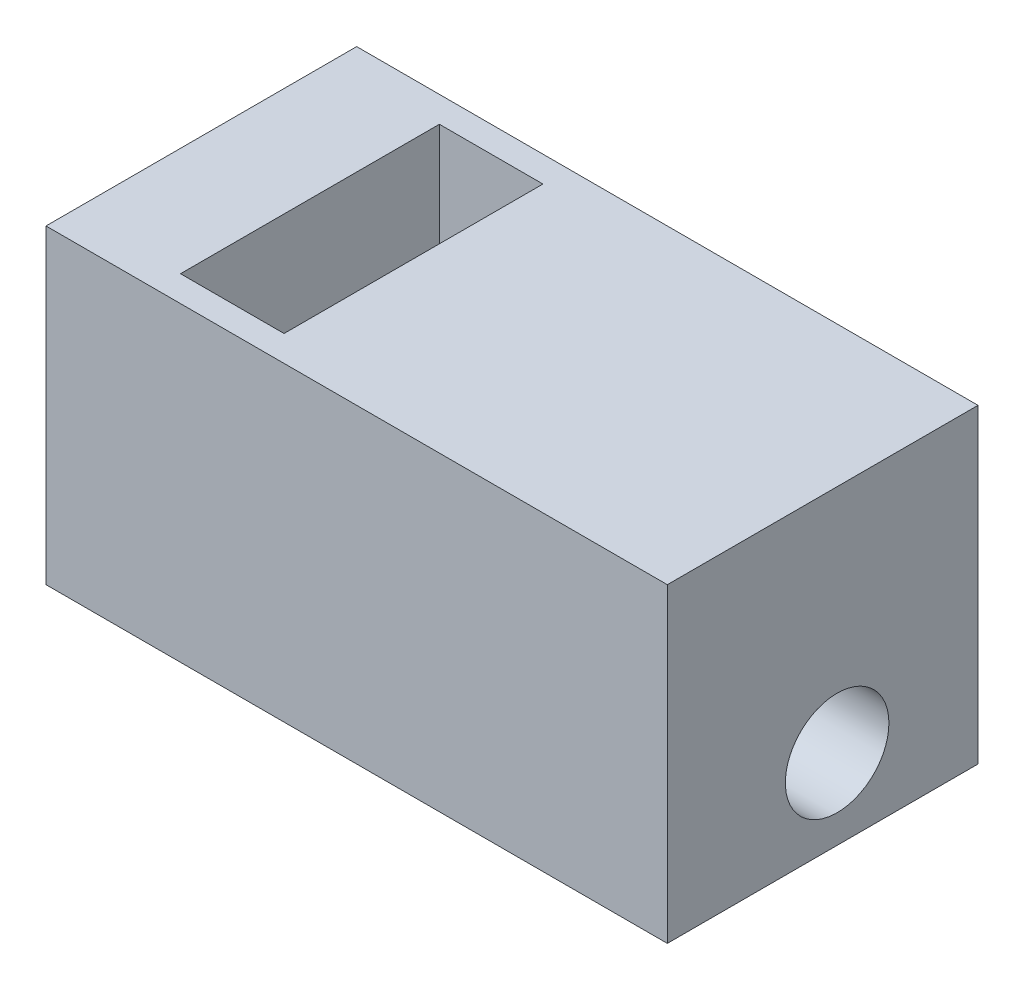
ISO-10303-21;
HEADER;
FILE_DESCRIPTION(('STEP AP214'),'2;1');
FILE_NAME('part.step','',(''),(''),'','','');
FILE_SCHEMA(('AUTOMOTIVE_DESIGN { 1 0 10303 214 1 1 1 1 }'));
ENDSEC;
DATA;
#1=APPLICATION_CONTEXT('core data for automotive mechanical design processes');
#2=APPLICATION_PROTOCOL_DEFINITION('international standard','automotive_design',2000,#1);
#3=PRODUCT_CONTEXT('',#1,'mechanical');
#4=PRODUCT('Part','Part','',(#3));
#5=PRODUCT_RELATED_PRODUCT_CATEGORY('part','',(#4));
#6=PRODUCT_DEFINITION_FORMATION('','',#4);
#7=PRODUCT_DEFINITION_CONTEXT('part definition',#1,'design');
#8=PRODUCT_DEFINITION('design','',#6,#7);
#9=PRODUCT_DEFINITION_SHAPE('','',#8);
#10=(LENGTH_UNIT() NAMED_UNIT(*) SI_UNIT(.MILLI.,.METRE.));
#11=(NAMED_UNIT(*) PLANE_ANGLE_UNIT() SI_UNIT($,.RADIAN.));
#12=(NAMED_UNIT(*) SI_UNIT($,.STERADIAN.) SOLID_ANGLE_UNIT());
#13=UNCERTAINTY_MEASURE_WITH_UNIT(LENGTH_MEASURE(1.E-05),#10,'distance_accuracy_value','');
#14=(GEOMETRIC_REPRESENTATION_CONTEXT(3) GLOBAL_UNCERTAINTY_ASSIGNED_CONTEXT((#13)) GLOBAL_UNIT_ASSIGNED_CONTEXT((#10,
#11,#12)) REPRESENTATION_CONTEXT('',''));
#15=CARTESIAN_POINT('',(0.,0.,0.));
#16=DIRECTION('',(0.,0.,1.));
#17=DIRECTION('',(1.,0.,0.));
#18=AXIS2_PLACEMENT_3D('',#15,#16,#17);
#19=CARTESIAN_POINT('',(-62.7474074074074,76.2,-36.0303703703704));
#20=DIRECTION('',(1.,0.,0.));
#21=DIRECTION('',(0.,0.,-1.));
#22=AXIS2_PLACEMENT_3D('',#19,#20,#21);
#23=PLANE('',#22);
#24=CARTESIAN_POINT('',(-62.7474074074074,19.6328159242611,-1.47817353605362));
#25=DIRECTION('',(1.,0.,0.));
#26=DIRECTION('',(0.,0.,-1.));
#27=AXIS2_PLACEMENT_3D('',#24,#25,#26);
#28=CIRCLE('',#27,12.7);
#29=CARTESIAN_POINT('',(-62.7474074074074,19.6328159242611,-14.1781735360536));
#30=VERTEX_POINT('',#29);
#31=EDGE_CURVE('E164',#30,#30,#28,.T.);
#32=ORIENTED_EDGE('',*,*,#31,.T.);
#33=EDGE_LOOP('',(#32));
#34=FACE_BOUND('',#33,.T.);
#35=DIRECTION('',(0.,0.,1.));
#36=VECTOR('',#35,1.);
#37=CARTESIAN_POINT('',(-62.7474074074074,0.,-36.0303703703704));
#38=LINE('',#37,#36);
#39=CARTESIAN_POINT('',(-62.7474074074074,0.,-36.0303703703704));
#40=VERTEX_POINT('',#39);
#41=CARTESIAN_POINT('',(-62.7474074074074,0.,40.1696296296296));
#42=VERTEX_POINT('',#41);
#43=EDGE_CURVE('E168',#40,#42,#38,.T.);
#44=ORIENTED_EDGE('',*,*,#43,.T.);
#45=DIRECTION('',(0.,-1.,0.));
#46=VECTOR('',#45,1.);
#47=CARTESIAN_POINT('',(-62.7474074074074,76.2,40.1696296296296));
#48=LINE('',#47,#46);
#49=CARTESIAN_POINT('',(-62.7474074074074,76.2,40.1696296296296));
#50=VERTEX_POINT('',#49);
#51=EDGE_CURVE('E11',#50,#42,#48,.T.);
#52=ORIENTED_EDGE('',*,*,#51,.F.);
#53=DIRECTION('',(0.,0.,1.));
#54=VECTOR('',#53,1.);
#55=CARTESIAN_POINT('',(-62.7474074074074,76.2,-36.0303703703704));
#56=LINE('',#55,#54);
#57=CARTESIAN_POINT('',(-62.7474074074074,76.2,-36.0303703703704));
#58=VERTEX_POINT('',#57);
#59=EDGE_CURVE('E172',#58,#50,#56,.T.);
#60=ORIENTED_EDGE('',*,*,#59,.F.);
#61=DIRECTION('',(0.,-1.,0.));
#62=VECTOR('',#61,1.);
#63=CARTESIAN_POINT('',(-62.7474074074074,76.2,-36.0303703703704));
#64=LINE('',#63,#62);
#65=EDGE_CURVE('E182',#58,#40,#64,.T.);
#66=ORIENTED_EDGE('',*,*,#65,.T.);
#67=EDGE_LOOP('',(#44,#52,#60,#66));
#68=FACE_BOUND('',#67,.T.);
#69=ADVANCED_FACE('F39',(#34,#68),#23,.F.);
#70=CARTESIAN_POINT('',(-62.7474074074074,76.2,40.1696296296296));
#71=DIRECTION('',(0.,0.,-1.));
#72=DIRECTION('',(-1.,0.,0.));
#73=AXIS2_PLACEMENT_3D('',#70,#71,#72);
#74=PLANE('',#73);
#75=DIRECTION('',(1.,0.,0.));
#76=VECTOR('',#75,1.);
#77=CARTESIAN_POINT('',(-62.7474074074074,0.,40.1696296296296));
#78=LINE('',#77,#76);
#79=CARTESIAN_POINT('',(89.6525925925926,0.,40.1696296296296));
#80=VERTEX_POINT('',#79);
#81=EDGE_CURVE('E186',#42,#80,#78,.T.);
#82=ORIENTED_EDGE('',*,*,#81,.T.);
#83=DIRECTION('',(0.,-1.,0.));
#84=VECTOR('',#83,1.);
#85=CARTESIAN_POINT('',(89.6525925925926,76.2,40.1696296296296));
#86=LINE('',#85,#84);
#87=CARTESIAN_POINT('',(89.6525925925926,76.2,40.1696296296296));
#88=VERTEX_POINT('',#87);
#89=EDGE_CURVE('E47',#88,#80,#86,.T.);
#90=ORIENTED_EDGE('',*,*,#89,.F.);
#91=DIRECTION('',(1.,0.,0.));
#92=VECTOR('',#91,1.);
#93=CARTESIAN_POINT('',(-62.7474074074074,76.2,40.1696296296296));
#94=LINE('',#93,#92);
#95=EDGE_CURVE('E91',#50,#88,#94,.T.);
#96=ORIENTED_EDGE('',*,*,#95,.F.);
#97=ORIENTED_EDGE('',*,*,#51,.T.);
#98=EDGE_LOOP('',(#82,#90,#96,#97));
#99=FACE_BOUND('',#98,.T.);
#100=ADVANCED_FACE('F221',(#99),#74,.F.);
#101=CARTESIAN_POINT('',(89.6525925925926,76.2,-36.0303703703704));
#102=DIRECTION('',(-1.,0.,0.));
#103=DIRECTION('',(0.,0.,1.));
#104=AXIS2_PLACEMENT_3D('',#101,#102,#103);
#105=PLANE('',#104);
#106=CARTESIAN_POINT('',(89.6525925925926,19.6328159242611,-1.47817353605362));
#107=DIRECTION('',(1.,0.,0.));
#108=DIRECTION('',(0.,0.,-1.));
#109=AXIS2_PLACEMENT_3D('',#106,#107,#108);
#110=CIRCLE('',#109,12.7);
#111=CARTESIAN_POINT('',(89.6525925925926,19.6328159242611,-14.1781735360536));
#112=VERTEX_POINT('',#111);
#113=EDGE_CURVE('E158',#112,#112,#110,.T.);
#114=ORIENTED_EDGE('',*,*,#113,.F.);
#115=EDGE_LOOP('',(#114));
#116=FACE_BOUND('',#115,.T.);
#117=DIRECTION('',(0.,0.,-1.));
#118=VECTOR('',#117,1.);
#119=CARTESIAN_POINT('',(89.6525925925926,0.,-36.0303703703704));
#120=LINE('',#119,#118);
#121=CARTESIAN_POINT('',(89.6525925925926,0.,-36.0303703703704));
#122=VERTEX_POINT('',#121);
#123=EDGE_CURVE('E189',#80,#122,#120,.T.);
#124=ORIENTED_EDGE('',*,*,#123,.T.);
#125=DIRECTION('',(0.,-1.,0.));
#126=VECTOR('',#125,1.);
#127=CARTESIAN_POINT('',(89.6525925925926,76.2,-36.0303703703704));
#128=LINE('',#127,#126);
#129=CARTESIAN_POINT('',(89.6525925925926,76.2,-36.0303703703704));
#130=VERTEX_POINT('',#129);
#131=EDGE_CURVE('E196',#130,#122,#128,.T.);
#132=ORIENTED_EDGE('',*,*,#131,.F.);
#133=DIRECTION('',(0.,0.,-1.));
#134=VECTOR('',#133,1.);
#135=CARTESIAN_POINT('',(89.6525925925926,76.2,-36.0303703703704));
#136=LINE('',#135,#134);
#137=EDGE_CURVE('E177',#88,#130,#136,.T.);
#138=ORIENTED_EDGE('',*,*,#137,.F.);
#139=ORIENTED_EDGE('',*,*,#89,.T.);
#140=EDGE_LOOP('',(#124,#132,#138,#139));
#141=FACE_BOUND('',#140,.T.);
#142=ADVANCED_FACE('F203',(#116,#141),#105,.F.);
#143=CARTESIAN_POINT('',(-62.7474074074074,76.2,-36.0303703703704));
#144=DIRECTION('',(0.,0.,1.));
#145=DIRECTION('',(1.,0.,0.));
#146=AXIS2_PLACEMENT_3D('',#143,#144,#145);
#147=PLANE('',#146);
#148=DIRECTION('',(-1.,0.,0.));
#149=VECTOR('',#148,1.);
#150=CARTESIAN_POINT('',(-62.7474074074074,0.,-36.0303703703704));
#151=LINE('',#150,#149);
#152=EDGE_CURVE('E84',#122,#40,#151,.T.);
#153=ORIENTED_EDGE('',*,*,#152,.T.);
#154=ORIENTED_EDGE('',*,*,#65,.F.);
#155=DIRECTION('',(-1.,0.,0.));
#156=VECTOR('',#155,1.);
#157=CARTESIAN_POINT('',(-62.7474074074074,76.2,-36.0303703703704));
#158=LINE('',#157,#156);
#159=EDGE_CURVE('E63',#130,#58,#158,.T.);
#160=ORIENTED_EDGE('',*,*,#159,.F.);
#161=ORIENTED_EDGE('',*,*,#131,.T.);
#162=EDGE_LOOP('',(#153,#154,#160,#161));
#163=FACE_BOUND('',#162,.T.);
#164=ADVANCED_FACE('F211',(#163),#147,.F.);
#165=CARTESIAN_POINT('',(0.,76.2,0.));
#166=DIRECTION('',(0.,1.,0.));
#167=DIRECTION('',(0.,0.,1.));
#168=AXIS2_PLACEMENT_3D('',#165,#166,#167);
#169=PLANE('',#168);
#170=DIRECTION('',(0.,0.,1.));
#171=VECTOR('',#170,1.);
#172=CARTESIAN_POINT('',(-36.1071284253569,76.2,-29.6803703703704));
#173=LINE('',#172,#171);
#174=CARTESIAN_POINT('',(-36.1071284253569,76.2,-29.6803703703704));
#175=VERTEX_POINT('',#174);
#176=CARTESIAN_POINT('',(-36.1071284253569,76.2,33.8196296296296));
#177=VERTEX_POINT('',#176);
#178=EDGE_CURVE('E54',#175,#177,#173,.T.);
#179=ORIENTED_EDGE('',*,*,#178,.F.);
#180=DIRECTION('',(-1.,0.,0.));
#181=VECTOR('',#180,1.);
#182=CARTESIAN_POINT('',(-36.1071284253569,76.2,-29.6803703703704));
#183=LINE('',#182,#181);
#184=CARTESIAN_POINT('',(-10.7071284253569,76.2,-29.6803703703704));
#185=VERTEX_POINT('',#184);
#186=EDGE_CURVE('E136',#185,#175,#183,.T.);
#187=ORIENTED_EDGE('',*,*,#186,.F.);
#188=DIRECTION('',(0.,0.,-1.));
#189=VECTOR('',#188,1.);
#190=CARTESIAN_POINT('',(-10.7071284253569,76.2,-29.6803703703704));
#191=LINE('',#190,#189);
#192=CARTESIAN_POINT('',(-10.7071284253569,76.2,33.8196296296296));
#193=VERTEX_POINT('',#192);
#194=EDGE_CURVE('E140',#193,#185,#191,.T.);
#195=ORIENTED_EDGE('',*,*,#194,.F.);
#196=DIRECTION('',(1.,0.,0.));
#197=VECTOR('',#196,1.);
#198=CARTESIAN_POINT('',(-36.1071284253569,76.2,33.8196296296296));
#199=LINE('',#198,#197);
#200=EDGE_CURVE('E149',#177,#193,#199,.T.);
#201=ORIENTED_EDGE('',*,*,#200,.F.);
#202=EDGE_LOOP('',(#179,#187,#195,#201));
#203=FACE_BOUND('',#202,.T.);
#204=ORIENTED_EDGE('',*,*,#59,.T.);
#205=ORIENTED_EDGE('',*,*,#95,.T.);
#206=ORIENTED_EDGE('',*,*,#137,.T.);
#207=ORIENTED_EDGE('',*,*,#159,.T.);
#208=EDGE_LOOP('',(#204,#205,#206,#207));
#209=FACE_BOUND('',#208,.T.);
#210=ADVANCED_FACE('F213',(#203,#209),#169,.T.);
#211=CARTESIAN_POINT('',(0.,0.,0.));
#212=DIRECTION('',(0.,1.,0.));
#213=DIRECTION('',(0.,0.,1.));
#214=AXIS2_PLACEMENT_3D('',#211,#212,#213);
#215=PLANE('',#214);
#216=ORIENTED_EDGE('',*,*,#43,.F.);
#217=ORIENTED_EDGE('',*,*,#152,.F.);
#218=ORIENTED_EDGE('',*,*,#123,.F.);
#219=ORIENTED_EDGE('',*,*,#81,.F.);
#220=EDGE_LOOP('',(#216,#217,#218,#219));
#221=FACE_BOUND('',#220,.T.);
#222=ADVANCED_FACE('F207',(#221),#215,.F.);
#223=CARTESIAN_POINT('',(-62.7474074074074,19.6328159242611,-1.47817353605362));
#224=DIRECTION('',(1.,0.,0.));
#225=DIRECTION('',(0.,0.,-1.));
#226=AXIS2_PLACEMENT_3D('',#223,#224,#225);
#227=CYLINDRICAL_SURFACE('',#226,12.7);
#228=CARTESIAN_POINT('',(-62.7474074074074,19.6328159242611,-14.1781735360536));
#229=CARTESIAN_POINT('',(-61.1599074074074,19.6328159242611,-14.1781735360536));
#230=CARTESIAN_POINT('',(-59.5724074074074,19.6328159242611,-14.1781735360536));
#231=CARTESIAN_POINT('',(-56.3974074074074,19.6328159242611,-14.1781735360536));
#232=CARTESIAN_POINT('',(-54.8099074074074,19.6328159242611,-14.1781735360536));
#233=CARTESIAN_POINT('',(-51.6349074074074,19.6328159242611,-14.1781735360536));
#234=CARTESIAN_POINT('',(-50.0474074074074,19.6328159242611,-14.1781735360536));
#235=CARTESIAN_POINT('',(-46.8724074074074,19.6328159242611,-14.1781735360536));
#236=CARTESIAN_POINT('',(-45.2849074074074,19.6328159242611,-14.1781735360536));
#237=CARTESIAN_POINT('',(-42.1099074074074,19.6328159242611,-14.1781735360536));
#238=CARTESIAN_POINT('',(-40.5224074074074,19.6328159242611,-14.1781735360536));
#239=CARTESIAN_POINT('',(-37.3474074074074,19.6328159242611,-14.1781735360536));
#240=CARTESIAN_POINT('',(-35.7599074074074,19.6328159242611,-14.1781735360536));
#241=CARTESIAN_POINT('',(-32.5849074074074,19.6328159242611,-14.1781735360536));
#242=CARTESIAN_POINT('',(-30.9974074074074,19.6328159242611,-14.1781735360536));
#243=CARTESIAN_POINT('',(-27.8224074074074,19.6328159242611,-14.1781735360536));
#244=CARTESIAN_POINT('',(-26.2349074074074,19.6328159242611,-14.1781735360536));
#245=CARTESIAN_POINT('',(-23.0599074074074,19.6328159242611,-14.1781735360536));
#246=CARTESIAN_POINT('',(-21.4724074074074,19.6328159242611,-14.1781735360536));
#247=CARTESIAN_POINT('',(-18.2974074074074,19.6328159242611,-14.1781735360536));
#248=CARTESIAN_POINT('',(-16.7099074074074,19.6328159242611,-14.1781735360536));
#249=CARTESIAN_POINT('',(-13.5349074074074,19.6328159242611,-14.1781735360536));
#250=CARTESIAN_POINT('',(-11.9474074074074,19.6328159242611,-14.1781735360536));
#251=CARTESIAN_POINT('',(-8.77240740740739,19.6328159242611,-14.1781735360536));
#252=CARTESIAN_POINT('',(-7.18490740740739,19.6328159242611,-14.1781735360536));
#253=CARTESIAN_POINT('',(-4.00990740740739,19.6328159242611,-14.1781735360536));
#254=CARTESIAN_POINT('',(-2.42240740740739,19.6328159242611,-14.1781735360536));
#255=CARTESIAN_POINT('',(0.752592592592606,19.6328159242611,-14.1781735360536));
#256=CARTESIAN_POINT('',(2.3400925925926,19.6328159242611,-14.1781735360536));
#257=CARTESIAN_POINT('',(5.51509259259259,19.6328159242611,-14.1781735360536));
#258=CARTESIAN_POINT('',(7.1025925925926,19.6328159242611,-14.1781735360536));
#259=CARTESIAN_POINT('',(10.2775925925926,19.6328159242611,-14.1781735360536));
#260=CARTESIAN_POINT('',(11.8650925925926,19.6328159242611,-14.1781735360536));
#261=CARTESIAN_POINT('',(15.0400925925926,19.6328159242611,-14.1781735360536));
#262=CARTESIAN_POINT('',(16.6275925925926,19.6328159242611,-14.1781735360536));
#263=CARTESIAN_POINT('',(19.8025925925926,19.6328159242611,-14.1781735360536));
#264=CARTESIAN_POINT('',(21.3900925925926,19.6328159242611,-14.1781735360536));
#265=CARTESIAN_POINT('',(24.5650925925926,19.6328159242611,-14.1781735360536));
#266=CARTESIAN_POINT('',(26.1525925925926,19.6328159242611,-14.1781735360536));
#267=CARTESIAN_POINT('',(29.3275925925926,19.6328159242611,-14.1781735360536));
#268=CARTESIAN_POINT('',(30.9150925925926,19.6328159242611,-14.1781735360536));
#269=CARTESIAN_POINT('',(34.0900925925926,19.6328159242611,-14.1781735360536));
#270=CARTESIAN_POINT('',(35.6775925925926,19.6328159242611,-14.1781735360536));
#271=CARTESIAN_POINT('',(38.8525925925926,19.6328159242611,-14.1781735360536));
#272=CARTESIAN_POINT('',(40.4400925925926,19.6328159242611,-14.1781735360536));
#273=CARTESIAN_POINT('',(43.6150925925926,19.6328159242611,-14.1781735360536));
#274=CARTESIAN_POINT('',(45.2025925925926,19.6328159242611,-14.1781735360536));
#275=CARTESIAN_POINT('',(48.3775925925926,19.6328159242611,-14.1781735360536));
#276=CARTESIAN_POINT('',(49.9650925925926,19.6328159242611,-14.1781735360536));
#277=CARTESIAN_POINT('',(53.1400925925926,19.6328159242611,-14.1781735360536));
#278=CARTESIAN_POINT('',(54.7275925925926,19.6328159242611,-14.1781735360536));
#279=CARTESIAN_POINT('',(57.9025925925926,19.6328159242611,-14.1781735360536));
#280=CARTESIAN_POINT('',(59.4900925925926,19.6328159242611,-14.1781735360536));
#281=CARTESIAN_POINT('',(62.6650925925926,19.6328159242611,-14.1781735360536));
#282=CARTESIAN_POINT('',(64.2525925925926,19.6328159242611,-14.1781735360536));
#283=CARTESIAN_POINT('',(67.4275925925926,19.6328159242611,-14.1781735360536));
#284=CARTESIAN_POINT('',(69.0150925925926,19.6328159242611,-14.1781735360536));
#285=CARTESIAN_POINT('',(72.1900925925926,19.6328159242611,-14.1781735360536));
#286=CARTESIAN_POINT('',(73.7775925925926,19.6328159242611,-14.1781735360536));
#287=CARTESIAN_POINT('',(76.9525925925926,19.6328159242611,-14.1781735360536));
#288=CARTESIAN_POINT('',(78.5400925925926,19.6328159242611,-14.1781735360536));
#289=CARTESIAN_POINT('',(81.7150925925926,19.6328159242611,-14.1781735360536));
#290=CARTESIAN_POINT('',(83.3025925925926,19.6328159242611,-14.1781735360536));
#291=CARTESIAN_POINT('',(86.4775925925926,19.6328159242611,-14.1781735360536));
#292=CARTESIAN_POINT('',(88.0650925925926,19.6328159242611,-14.1781735360536));
#293=CARTESIAN_POINT('',(89.6525925925926,19.6328159242611,-14.1781735360536));
#294=B_SPLINE_CURVE_WITH_KNOTS('',3,(#228,#229,#230,#231,#232,#233,#234,#235,#236,#237,#238,
#239,#240,#241,#242,#243,#244,#245,#246,#247,#248,#249,#250,#251,#252,#253,#254,#255,#256,#257,
#258,#259,#260,#261,#262,#263,#264,#265,#266,#267,#268,#269,#270,#271,#272,#273,#274,#275,#276,
#277,#278,#279,#280,#281,#282,#283,#284,#285,#286,#287,#288,#289,#290,#291,#292,#293),
.UNSPECIFIED.,.F.,.F.,(4,2,2,2,2,2,2,2,2,2,2,2,2,2,2,2,2,2,2,2,2,2,2,2,2,2,2,2,2,2,2,2,4),(0.,
4.76250000000001,9.52500000000001,14.2875,19.05,23.8125,28.575,33.3375,38.1,42.8625,47.625,
52.3875,57.15,61.9125,66.675,71.4375,76.2,80.9625,85.725,90.4875,95.25,100.0125,104.775,
109.5375,114.3,119.0625,123.825,128.5875,133.35,138.1125,142.875,147.6375,152.4),.UNSPECIFIED.);
#295=EDGE_CURVE('BSEAM232',#30,#112,#294,.T.);
#296=ORIENTED_EDGE('',*,*,#31,.F.);
#297=ORIENTED_EDGE('',*,*,#113,.T.);
#298=ORIENTED_EDGE('',*,*,#295,.T.);
#299=ORIENTED_EDGE('',*,*,#295,.F.);
#300=EDGE_LOOP('',(#296,#298,#297,#299));
#301=FACE_BOUND('',#300,.T.);
#302=ADVANCED_FACE('F232',(#301),#227,.F.);
#303=CARTESIAN_POINT('',(-36.1071284253569,50.8,-29.6803703703704));
#304=DIRECTION('',(-1.,0.,0.));
#305=DIRECTION('',(0.,0.,1.));
#306=AXIS2_PLACEMENT_3D('',#303,#304,#305);
#307=PLANE('',#306);
#308=ORIENTED_EDGE('',*,*,#178,.T.);
#309=DIRECTION('',(0.,1.,0.));
#310=VECTOR('',#309,1.);
#311=CARTESIAN_POINT('',(-36.1071284253569,50.8,33.8196296296296));
#312=LINE('',#311,#310);
#313=CARTESIAN_POINT('',(-36.1071284253569,50.8,33.8196296296296));
#314=VERTEX_POINT('',#313);
#315=EDGE_CURVE('E111',#314,#177,#312,.T.);
#316=ORIENTED_EDGE('',*,*,#315,.F.);
#317=DIRECTION('',(0.,0.,1.));
#318=VECTOR('',#317,1.);
#319=CARTESIAN_POINT('',(-36.1071284253569,50.8,-29.6803703703704));
#320=LINE('',#319,#318);
#321=CARTESIAN_POINT('',(-36.1071284253569,50.8,-29.6803703703704));
#322=VERTEX_POINT('',#321);
#323=EDGE_CURVE('E115',#322,#314,#320,.T.);
#324=ORIENTED_EDGE('',*,*,#323,.F.);
#325=DIRECTION('',(0.,1.,0.));
#326=VECTOR('',#325,1.);
#327=CARTESIAN_POINT('',(-36.1071284253569,50.8,-29.6803703703704));
#328=LINE('',#327,#326);
#329=EDGE_CURVE('E155',#322,#175,#328,.T.);
#330=ORIENTED_EDGE('',*,*,#329,.T.);
#331=EDGE_LOOP('',(#308,#316,#324,#330));
#332=FACE_BOUND('',#331,.T.);
#333=ADVANCED_FACE('F113',(#332),#307,.F.);
#334=CARTESIAN_POINT('',(-36.1071284253569,50.8,-29.6803703703704));
#335=DIRECTION('',(0.,0.,-1.));
#336=DIRECTION('',(-1.,0.,0.));
#337=AXIS2_PLACEMENT_3D('',#334,#335,#336);
#338=PLANE('',#337);
#339=ORIENTED_EDGE('',*,*,#186,.T.);
#340=ORIENTED_EDGE('',*,*,#329,.F.);
#341=DIRECTION('',(-1.,0.,0.));
#342=VECTOR('',#341,1.);
#343=CARTESIAN_POINT('',(-36.1071284253569,50.8,-29.6803703703704));
#344=LINE('',#343,#342);
#345=CARTESIAN_POINT('',(-10.7071284253569,50.8,-29.6803703703704));
#346=VERTEX_POINT('',#345);
#347=EDGE_CURVE('E122',#346,#322,#344,.T.);
#348=ORIENTED_EDGE('',*,*,#347,.F.);
#349=DIRECTION('',(0.,1.,0.));
#350=VECTOR('',#349,1.);
#351=CARTESIAN_POINT('',(-10.7071284253569,50.8,-29.6803703703704));
#352=LINE('',#351,#350);
#353=EDGE_CURVE('E159',#346,#185,#352,.T.);
#354=ORIENTED_EDGE('',*,*,#353,.T.);
#355=EDGE_LOOP('',(#339,#340,#348,#354));
#356=FACE_BOUND('',#355,.T.);
#357=ADVANCED_FACE('F241',(#356),#338,.F.);
#358=CARTESIAN_POINT('',(-10.7071284253569,50.8,-29.6803703703704));
#359=DIRECTION('',(1.,0.,0.));
#360=DIRECTION('',(0.,0.,-1.));
#361=AXIS2_PLACEMENT_3D('',#358,#359,#360);
#362=PLANE('',#361);
#363=ORIENTED_EDGE('',*,*,#194,.T.);
#364=ORIENTED_EDGE('',*,*,#353,.F.);
#365=DIRECTION('',(0.,0.,-1.));
#366=VECTOR('',#365,1.);
#367=CARTESIAN_POINT('',(-10.7071284253569,50.8,-29.6803703703704));
#368=LINE('',#367,#366);
#369=CARTESIAN_POINT('',(-10.7071284253569,50.8,33.8196296296296));
#370=VERTEX_POINT('',#369);
#371=EDGE_CURVE('E131',#370,#346,#368,.T.);
#372=ORIENTED_EDGE('',*,*,#371,.F.);
#373=DIRECTION('',(0.,1.,0.));
#374=VECTOR('',#373,1.);
#375=CARTESIAN_POINT('',(-10.7071284253569,50.8,33.8196296296296));
#376=LINE('',#375,#374);
#377=EDGE_CURVE('E121',#370,#193,#376,.T.);
#378=ORIENTED_EDGE('',*,*,#377,.T.);
#379=EDGE_LOOP('',(#363,#364,#372,#378));
#380=FACE_BOUND('',#379,.T.);
#381=ADVANCED_FACE('F246',(#380),#362,.F.);
#382=CARTESIAN_POINT('',(-36.1071284253569,50.8,33.8196296296296));
#383=DIRECTION('',(0.,0.,1.));
#384=DIRECTION('',(1.,0.,0.));
#385=AXIS2_PLACEMENT_3D('',#382,#383,#384);
#386=PLANE('',#385);
#387=ORIENTED_EDGE('',*,*,#200,.T.);
#388=ORIENTED_EDGE('',*,*,#377,.F.);
#389=DIRECTION('',(1.,0.,0.));
#390=VECTOR('',#389,1.);
#391=CARTESIAN_POINT('',(-36.1071284253569,50.8,33.8196296296296));
#392=LINE('',#391,#390);
#393=EDGE_CURVE('E125',#314,#370,#392,.T.);
#394=ORIENTED_EDGE('',*,*,#393,.F.);
#395=ORIENTED_EDGE('',*,*,#315,.T.);
#396=EDGE_LOOP('',(#387,#388,#394,#395));
#397=FACE_BOUND('',#396,.T.);
#398=ADVANCED_FACE('F126',(#397),#386,.F.);
#399=CARTESIAN_POINT('',(0.,50.8,0.));
#400=DIRECTION('',(0.,1.,0.));
#401=DIRECTION('',(0.,0.,1.));
#402=AXIS2_PLACEMENT_3D('',#399,#400,#401);
#403=PLANE('',#402);
#404=ORIENTED_EDGE('',*,*,#323,.T.);
#405=ORIENTED_EDGE('',*,*,#393,.T.);
#406=ORIENTED_EDGE('',*,*,#371,.T.);
#407=ORIENTED_EDGE('',*,*,#347,.T.);
#408=EDGE_LOOP('',(#404,#405,#406,#407));
#409=FACE_BOUND('',#408,.T.);
#410=ADVANCED_FACE('F133',(#409),#403,.T.);
#411=CLOSED_SHELL('',(#69,#100,#142,#164,#210,#222,#302,#333,#357,#381,#398,#410));
#412=MANIFOLD_SOLID_BREP('B2',#411);
#413=ADVANCED_BREP_SHAPE_REPRESENTATION('',(#18,#412),#14);
#414=SHAPE_DEFINITION_REPRESENTATION(#9,#413);
ENDSEC;
END-ISO-10303-21;
